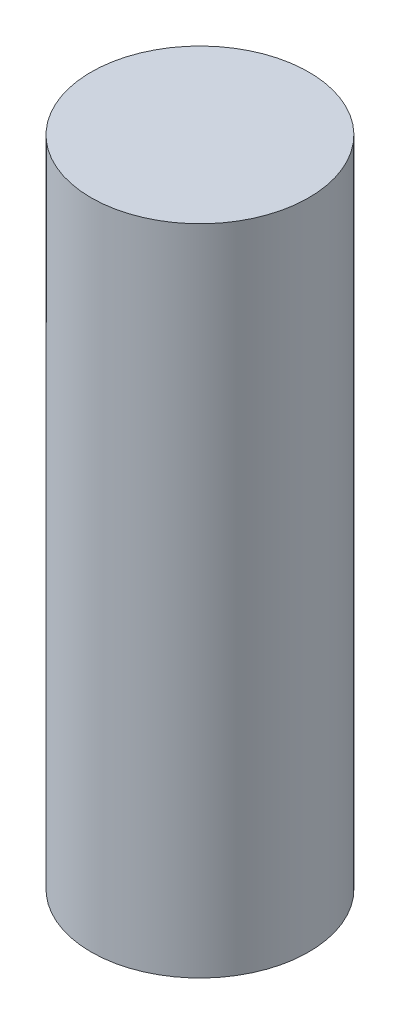
ISO-10303-21;
HEADER;
FILE_DESCRIPTION(('STEP AP214'),'2;1');
FILE_NAME('part.step','',(''),(''),'','','');
FILE_SCHEMA(('AUTOMOTIVE_DESIGN { 1 0 10303 214 1 1 1 1 }'));
ENDSEC;
DATA;
#1=APPLICATION_CONTEXT('core data for automotive mechanical design processes');
#2=APPLICATION_PROTOCOL_DEFINITION('international standard','automotive_design',2000,#1);
#3=PRODUCT_CONTEXT('',#1,'mechanical');
#4=PRODUCT('Part','Part','',(#3));
#5=PRODUCT_RELATED_PRODUCT_CATEGORY('part','',(#4));
#6=PRODUCT_DEFINITION_FORMATION('','',#4);
#7=PRODUCT_DEFINITION_CONTEXT('part definition',#1,'design');
#8=PRODUCT_DEFINITION('design','',#6,#7);
#9=PRODUCT_DEFINITION_SHAPE('','',#8);
#10=(LENGTH_UNIT() NAMED_UNIT(*) SI_UNIT(.MILLI.,.METRE.));
#11=(NAMED_UNIT(*) PLANE_ANGLE_UNIT() SI_UNIT($,.RADIAN.));
#12=(NAMED_UNIT(*) SI_UNIT($,.STERADIAN.) SOLID_ANGLE_UNIT());
#13=UNCERTAINTY_MEASURE_WITH_UNIT(LENGTH_MEASURE(1.E-05),#10,'distance_accuracy_value','');
#14=(GEOMETRIC_REPRESENTATION_CONTEXT(3) GLOBAL_UNCERTAINTY_ASSIGNED_CONTEXT((#13)) GLOBAL_UNIT_ASSIGNED_CONTEXT((#10,
#11,#12)) REPRESENTATION_CONTEXT('',''));
#15=CARTESIAN_POINT('',(0.,0.,0.));
#16=DIRECTION('',(0.,0.,1.));
#17=DIRECTION('',(1.,0.,0.));
#18=AXIS2_PLACEMENT_3D('',#15,#16,#17);
#19=CARTESIAN_POINT('',(0.,30.,0.));
#20=DIRECTION('',(0.,-1.,0.));
#21=DIRECTION('',(0.,0.,-1.));
#22=AXIS2_PLACEMENT_3D('',#19,#20,#21);
#23=CYLINDRICAL_SURFACE('',#22,5.);
#24=CARTESIAN_POINT('',(0.,30.,0.));
#25=DIRECTION('',(0.,1.,0.));
#26=DIRECTION('',(0.,0.,1.));
#27=AXIS2_PLACEMENT_3D('',#24,#25,#26);
#28=CIRCLE('',#27,5.);
#29=CARTESIAN_POINT('',(0.,30.,5.));
#30=VERTEX_POINT('',#29);
#31=EDGE_CURVE('E11',#30,#30,#28,.T.);
#32=ORIENTED_EDGE('',*,*,#31,.F.);
#33=EDGE_LOOP('',(#32));
#34=FACE_BOUND('',#33,.T.);
#35=CARTESIAN_POINT('',(0.,0.,0.));
#36=DIRECTION('',(0.,1.,0.));
#37=DIRECTION('',(0.,0.,1.));
#38=AXIS2_PLACEMENT_3D('',#35,#36,#37);
#39=CIRCLE('',#38,5.);
#40=CARTESIAN_POINT('',(0.,0.,5.));
#41=VERTEX_POINT('',#40);
#42=EDGE_CURVE('E41',#41,#41,#39,.T.);
#43=ORIENTED_EDGE('',*,*,#42,.T.);
#44=EDGE_LOOP('',(#43));
#45=FACE_BOUND('',#44,.T.);
#46=ADVANCED_FACE('F33',(#34,#45),#23,.T.);
#47=CARTESIAN_POINT('',(0.,30.,0.));
#48=DIRECTION('',(0.,1.,0.));
#49=DIRECTION('',(0.,0.,1.));
#50=AXIS2_PLACEMENT_3D('',#47,#48,#49);
#51=PLANE('',#50);
#52=ORIENTED_EDGE('',*,*,#31,.T.);
#53=EDGE_LOOP('',(#52));
#54=FACE_BOUND('',#53,.T.);
#55=ADVANCED_FACE('F97',(#54),#51,.T.);
#56=CARTESIAN_POINT('',(0.,0.,0.));
#57=DIRECTION('',(0.,1.,0.));
#58=DIRECTION('',(0.,0.,1.));
#59=AXIS2_PLACEMENT_3D('',#56,#57,#58);
#60=PLANE('',#59);
#61=CARTESIAN_POINT('',(0.,0.,0.));
#62=DIRECTION('',(0.,-1.,0.));
#63=DIRECTION('',(0.,0.,-1.));
#64=AXIS2_PLACEMENT_3D('',#61,#62,#63);
#65=CIRCLE('',#64,2.5);
#66=CARTESIAN_POINT('',(0.,0.,-2.5));
#67=VERTEX_POINT('',#66);
#68=EDGE_CURVE('E68',#67,#67,#65,.T.);
#69=ORIENTED_EDGE('',*,*,#68,.F.);
#70=EDGE_LOOP('',(#69));
#71=FACE_BOUND('',#70,.T.);
#72=ORIENTED_EDGE('',*,*,#42,.F.);
#73=EDGE_LOOP('',(#72));
#74=FACE_BOUND('',#73,.T.);
#75=ADVANCED_FACE('F102',(#71,#74),#60,.F.);
#76=CARTESIAN_POINT('',(0.,10.,0.));
#77=DIRECTION('',(0.,-1.,0.));
#78=DIRECTION('',(0.,0.,-1.));
#79=AXIS2_PLACEMENT_3D('',#76,#77,#78);
#80=CYLINDRICAL_SURFACE('',#79,2.5);
#81=CARTESIAN_POINT('',(0.,10.,0.));
#82=DIRECTION('',(0.,-1.,0.));
#83=DIRECTION('',(0.,0.,-1.));
#84=AXIS2_PLACEMENT_3D('',#81,#82,#83);
#85=CIRCLE('',#84,2.5);
#86=CARTESIAN_POINT('',(2.,10.,-1.5));
#87=VERTEX_POINT('',#86);
#88=CARTESIAN_POINT('',(2.,10.,1.5));
#89=VERTEX_POINT('',#88);
#90=EDGE_CURVE('E64',#87,#89,#85,.T.);
#91=ORIENTED_EDGE('',*,*,#90,.F.);
#92=DIRECTION('',(0.,-1.,0.));
#93=VECTOR('',#92,1.);
#94=CARTESIAN_POINT('',(2.,20.,-1.5));
#95=LINE('',#94,#93);
#96=CARTESIAN_POINT('',(2.,20.,-1.5));
#97=VERTEX_POINT('',#96);
#98=EDGE_CURVE('E49',#97,#87,#95,.T.);
#99=ORIENTED_EDGE('',*,*,#98,.F.);
#100=CARTESIAN_POINT('',(0.,20.,0.));
#101=DIRECTION('',(0.,-1.,0.));
#102=DIRECTION('',(0.,0.,-1.));
#103=AXIS2_PLACEMENT_3D('',#100,#101,#102);
#104=CIRCLE('',#103,2.5);
#105=CARTESIAN_POINT('',(2.,20.,1.5));
#106=VERTEX_POINT('',#105);
#107=EDGE_CURVE('E66',#106,#97,#104,.T.);
#108=ORIENTED_EDGE('',*,*,#107,.F.);
#109=DIRECTION('',(0.,-1.,0.));
#110=VECTOR('',#109,1.);
#111=CARTESIAN_POINT('',(2.,20.,1.5));
#112=LINE('',#111,#110);
#113=EDGE_CURVE('E55',#106,#89,#112,.T.);
#114=ORIENTED_EDGE('',*,*,#113,.T.);
#115=EDGE_LOOP('',(#91,#99,#108,#114));
#116=FACE_BOUND('',#115,.T.);
#117=ORIENTED_EDGE('',*,*,#68,.T.);
#118=EDGE_LOOP('',(#117));
#119=FACE_BOUND('',#118,.T.);
#120=ADVANCED_FACE('F61',(#116,#119),#80,.F.);
#121=CARTESIAN_POINT('',(0.,10.,0.));
#122=DIRECTION('',(0.,-1.,0.));
#123=DIRECTION('',(0.,0.,-1.));
#124=AXIS2_PLACEMENT_3D('',#121,#122,#123);
#125=PLANE('',#124);
#126=DIRECTION('',(0.,0.,1.));
#127=VECTOR('',#126,1.);
#128=CARTESIAN_POINT('',(2.,10.,1.5));
#129=LINE('',#128,#127);
#130=EDGE_CURVE('E69',#87,#89,#129,.T.);
#131=ORIENTED_EDGE('',*,*,#130,.F.);
#132=ORIENTED_EDGE('',*,*,#90,.T.);
#133=EDGE_LOOP('',(#131,#132));
#134=FACE_BOUND('',#133,.T.);
#135=ADVANCED_FACE('F73',(#134),#125,.T.);
#136=CARTESIAN_POINT('',(2.,20.,1.5));
#137=DIRECTION('',(1.,0.,0.));
#138=DIRECTION('',(0.,0.,-1.));
#139=AXIS2_PLACEMENT_3D('',#136,#137,#138);
#140=PLANE('',#139);
#141=ORIENTED_EDGE('',*,*,#130,.T.);
#142=ORIENTED_EDGE('',*,*,#113,.F.);
#143=DIRECTION('',(0.,0.,1.));
#144=VECTOR('',#143,1.);
#145=CARTESIAN_POINT('',(2.,20.,1.5));
#146=LINE('',#145,#144);
#147=EDGE_CURVE('E86',#97,#106,#146,.T.);
#148=ORIENTED_EDGE('',*,*,#147,.F.);
#149=ORIENTED_EDGE('',*,*,#98,.T.);
#150=EDGE_LOOP('',(#141,#142,#148,#149));
#151=FACE_BOUND('',#150,.T.);
#152=ADVANCED_FACE('F70',(#151),#140,.F.);
#153=CARTESIAN_POINT('',(0.,20.,0.));
#154=DIRECTION('',(0.,-1.,0.));
#155=DIRECTION('',(0.,0.,-1.));
#156=AXIS2_PLACEMENT_3D('',#153,#154,#155);
#157=PLANE('',#156);
#158=ORIENTED_EDGE('',*,*,#107,.T.);
#159=ORIENTED_EDGE('',*,*,#147,.T.);
#160=EDGE_LOOP('',(#158,#159));
#161=FACE_BOUND('',#160,.T.);
#162=ADVANCED_FACE('F89',(#161),#157,.T.);
#163=CLOSED_SHELL('',(#46,#55,#75,#120,#135,#152,#162));
#164=MANIFOLD_SOLID_BREP('B2',#163);
#165=ADVANCED_BREP_SHAPE_REPRESENTATION('',(#18,#164),#14);
#166=SHAPE_DEFINITION_REPRESENTATION(#9,#165);
ENDSEC;
END-ISO-10303-21;
